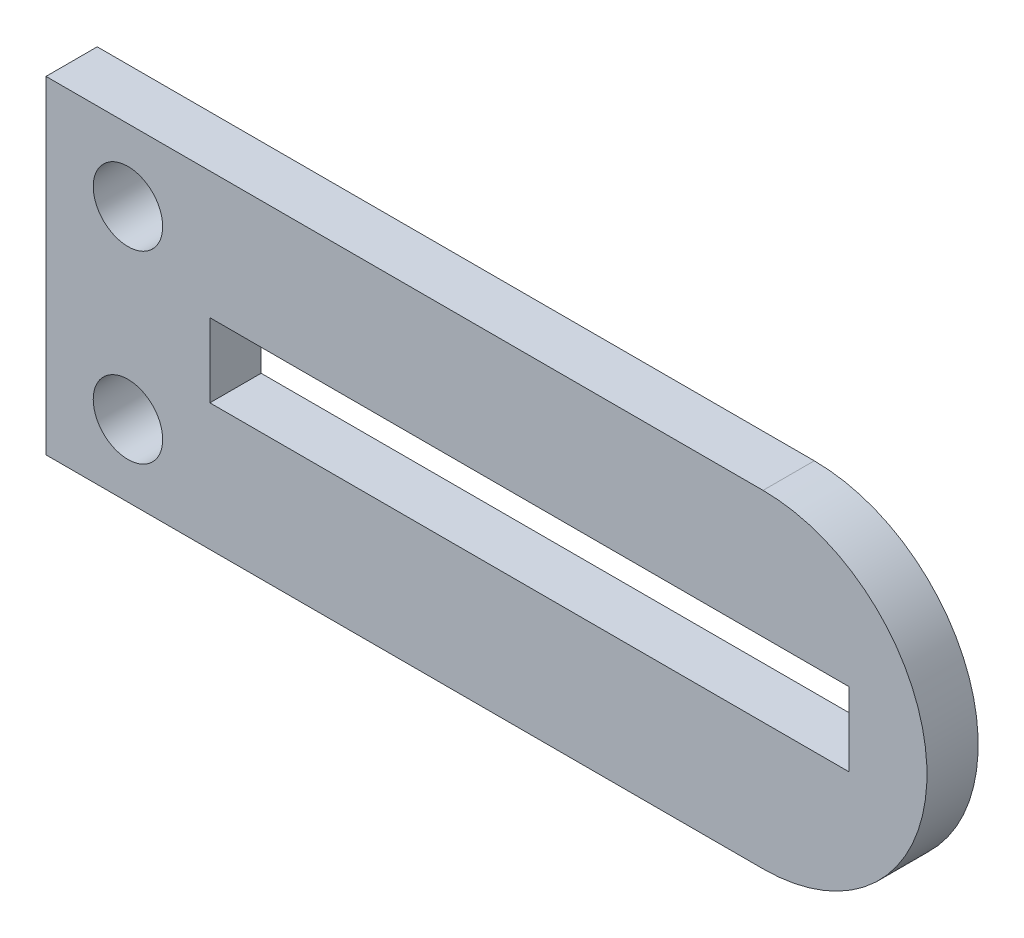
ISO-10303-21;
HEADER;
FILE_DESCRIPTION(('STEP AP214'),'2;1');
FILE_NAME('part.step','',(''),(''),'','','');
FILE_SCHEMA(('AUTOMOTIVE_DESIGN { 1 0 10303 214 1 1 1 1 }'));
ENDSEC;
DATA;
#1=APPLICATION_CONTEXT('core data for automotive mechanical design processes');
#2=APPLICATION_PROTOCOL_DEFINITION('international standard','automotive_design',2000,#1);
#3=PRODUCT_CONTEXT('',#1,'mechanical');
#4=PRODUCT('Part','Part','',(#3));
#5=PRODUCT_RELATED_PRODUCT_CATEGORY('part','',(#4));
#6=PRODUCT_DEFINITION_FORMATION('','',#4);
#7=PRODUCT_DEFINITION_CONTEXT('part definition',#1,'design');
#8=PRODUCT_DEFINITION('design','',#6,#7);
#9=PRODUCT_DEFINITION_SHAPE('','',#8);
#10=(LENGTH_UNIT() NAMED_UNIT(*) SI_UNIT(.MILLI.,.METRE.));
#11=(NAMED_UNIT(*) PLANE_ANGLE_UNIT() SI_UNIT($,.RADIAN.));
#12=(NAMED_UNIT(*) SI_UNIT($,.STERADIAN.) SOLID_ANGLE_UNIT());
#13=UNCERTAINTY_MEASURE_WITH_UNIT(LENGTH_MEASURE(1.E-05),#10,'distance_accuracy_value','');
#14=(GEOMETRIC_REPRESENTATION_CONTEXT(3) GLOBAL_UNCERTAINTY_ASSIGNED_CONTEXT((#13)) GLOBAL_UNIT_ASSIGNED_CONTEXT((#10,
#11,#12)) REPRESENTATION_CONTEXT('',''));
#15=CARTESIAN_POINT('',(0.,0.,0.));
#16=DIRECTION('',(0.,0.,1.));
#17=DIRECTION('',(1.,0.,0.));
#18=AXIS2_PLACEMENT_3D('',#15,#16,#17);
#19=CARTESIAN_POINT('',(44.45,10.16,3.175));
#20=DIRECTION('',(0.,0.,-1.));
#21=DIRECTION('',(-1.,0.,0.));
#22=AXIS2_PLACEMENT_3D('',#19,#20,#21);
#23=PLANE('',#22);
#24=DIRECTION('',(1.,0.,0.));
#25=VECTOR('',#24,1.);
#26=CARTESIAN_POINT('',(44.45,0.,3.175));
#27=LINE('',#26,#25);
#28=CARTESIAN_POINT('',(0.,0.,3.175));
#29=VERTEX_POINT('',#28);
#30=CARTESIAN_POINT('',(44.45,0.,3.175));
#31=VERTEX_POINT('',#30);
#32=EDGE_CURVE('E145',#29,#31,#27,.T.);
#33=ORIENTED_EDGE('',*,*,#32,.T.);
#34=CARTESIAN_POINT('',(44.45,10.16,3.175));
#35=DIRECTION('',(0.,0.,1.));
#36=DIRECTION('',(-1.,0.,0.));
#37=AXIS2_PLACEMENT_3D('',#34,#35,#36);
#38=CIRCLE('',#37,10.16);
#39=CARTESIAN_POINT('',(44.45,20.32,3.175));
#40=VERTEX_POINT('',#39);
#41=EDGE_CURVE('E148',#31,#40,#38,.T.);
#42=ORIENTED_EDGE('',*,*,#41,.T.);
#43=DIRECTION('',(-1.,0.,0.));
#44=VECTOR('',#43,1.);
#45=CARTESIAN_POINT('',(0.,20.32,3.175));
#46=LINE('',#45,#44);
#47=CARTESIAN_POINT('',(0.,20.32,3.175));
#48=VERTEX_POINT('',#47);
#49=EDGE_CURVE('E151',#40,#48,#46,.T.);
#50=ORIENTED_EDGE('',*,*,#49,.T.);
#51=DIRECTION('',(0.,-1.,0.));
#52=VECTOR('',#51,1.);
#53=CARTESIAN_POINT('',(0.,0.,3.175));
#54=LINE('',#53,#52);
#55=EDGE_CURVE('E153',#48,#29,#54,.T.);
#56=ORIENTED_EDGE('',*,*,#55,.T.);
#57=EDGE_LOOP('',(#33,#42,#50,#56));
#58=FACE_BOUND('',#57,.T.);
#59=DIRECTION('',(0.,1.,0.));
#60=VECTOR('',#59,1.);
#61=CARTESIAN_POINT('',(49.784,7.874,3.175));
#62=LINE('',#61,#60);
#63=CARTESIAN_POINT('',(49.784,7.874,3.175));
#64=VERTEX_POINT('',#63);
#65=CARTESIAN_POINT('',(49.784,12.446,3.175));
#66=VERTEX_POINT('',#65);
#67=EDGE_CURVE('E106',#64,#66,#62,.T.);
#68=ORIENTED_EDGE('',*,*,#67,.F.);
#69=DIRECTION('',(1.,0.,0.));
#70=VECTOR('',#69,1.);
#71=CARTESIAN_POINT('',(10.16,7.874,3.175));
#72=LINE('',#71,#70);
#73=CARTESIAN_POINT('',(10.16,7.874,3.175));
#74=VERTEX_POINT('',#73);
#75=EDGE_CURVE('E129',#74,#64,#72,.T.);
#76=ORIENTED_EDGE('',*,*,#75,.F.);
#77=DIRECTION('',(0.,-1.,0.));
#78=VECTOR('',#77,1.);
#79=CARTESIAN_POINT('',(10.16,7.874,3.175));
#80=LINE('',#79,#78);
#81=CARTESIAN_POINT('',(10.16,12.446,3.175));
#82=VERTEX_POINT('',#81);
#83=EDGE_CURVE('E127',#82,#74,#80,.T.);
#84=ORIENTED_EDGE('',*,*,#83,.F.);
#85=DIRECTION('',(-1.,0.,0.));
#86=VECTOR('',#85,1.);
#87=CARTESIAN_POINT('',(10.16,12.446,3.175));
#88=LINE('',#87,#86);
#89=EDGE_CURVE('E114',#66,#82,#88,.T.);
#90=ORIENTED_EDGE('',*,*,#89,.F.);
#91=EDGE_LOOP('',(#68,#76,#84,#90));
#92=FACE_BOUND('',#91,.T.);
#93=CARTESIAN_POINT('',(5.08,15.875,3.175));
#94=DIRECTION('',(0.,0.,1.));
#95=DIRECTION('',(1.,0.,0.));
#96=AXIS2_PLACEMENT_3D('',#93,#94,#95);
#97=CIRCLE('',#96,2.15265);
#98=CARTESIAN_POINT('',(7.23265,15.875,3.175));
#99=VERTEX_POINT('',#98);
#100=EDGE_CURVE('E135',#99,#99,#97,.T.);
#101=ORIENTED_EDGE('',*,*,#100,.F.);
#102=EDGE_LOOP('',(#101));
#103=FACE_BOUND('',#102,.T.);
#104=CARTESIAN_POINT('',(5.08,4.445,3.175));
#105=DIRECTION('',(0.,0.,1.));
#106=DIRECTION('',(-1.,0.,0.));
#107=AXIS2_PLACEMENT_3D('',#104,#105,#106);
#108=CIRCLE('',#107,2.15265);
#109=CARTESIAN_POINT('',(2.92735,4.445,3.175));
#110=VERTEX_POINT('',#109);
#111=EDGE_CURVE('E234',#110,#110,#108,.T.);
#112=ORIENTED_EDGE('',*,*,#111,.F.);
#113=EDGE_LOOP('',(#112));
#114=FACE_BOUND('',#113,.T.);
#115=ADVANCED_FACE('F41',(#58,#92,#103,#114),#23,.F.);
#116=CARTESIAN_POINT('',(44.45,10.16,0.));
#117=DIRECTION('',(0.,0.,-1.));
#118=DIRECTION('',(-1.,0.,0.));
#119=AXIS2_PLACEMENT_3D('',#116,#117,#118);
#120=PLANE('',#119);
#121=CARTESIAN_POINT('',(5.08,15.875,0.));
#122=DIRECTION('',(0.,0.,1.));
#123=DIRECTION('',(1.,0.,0.));
#124=AXIS2_PLACEMENT_3D('',#121,#122,#123);
#125=CIRCLE('',#124,2.15265);
#126=CARTESIAN_POINT('',(7.23265,15.875,0.));
#127=VERTEX_POINT('',#126);
#128=EDGE_CURVE('E240',#127,#127,#125,.T.);
#129=ORIENTED_EDGE('',*,*,#128,.T.);
#130=EDGE_LOOP('',(#129));
#131=FACE_BOUND('',#130,.T.);
#132=DIRECTION('',(1.,0.,0.));
#133=VECTOR('',#132,1.);
#134=CARTESIAN_POINT('',(44.45,0.,0.));
#135=LINE('',#134,#133);
#136=CARTESIAN_POINT('',(0.,0.,0.));
#137=VERTEX_POINT('',#136);
#138=CARTESIAN_POINT('',(44.45,0.,0.));
#139=VERTEX_POINT('',#138);
#140=EDGE_CURVE('E122',#137,#139,#135,.T.);
#141=ORIENTED_EDGE('',*,*,#140,.F.);
#142=DIRECTION('',(0.,-1.,0.));
#143=VECTOR('',#142,1.);
#144=CARTESIAN_POINT('',(0.,0.,0.));
#145=LINE('',#144,#143);
#146=CARTESIAN_POINT('',(0.,20.32,0.));
#147=VERTEX_POINT('',#146);
#148=EDGE_CURVE('E149',#147,#137,#145,.T.);
#149=ORIENTED_EDGE('',*,*,#148,.F.);
#150=DIRECTION('',(-1.,0.,0.));
#151=VECTOR('',#150,1.);
#152=CARTESIAN_POINT('',(0.,20.32,0.));
#153=LINE('',#152,#151);
#154=CARTESIAN_POINT('',(44.45,20.32,0.));
#155=VERTEX_POINT('',#154);
#156=EDGE_CURVE('E160',#155,#147,#153,.T.);
#157=ORIENTED_EDGE('',*,*,#156,.F.);
#158=CARTESIAN_POINT('',(44.45,10.16,0.));
#159=DIRECTION('',(0.,0.,1.));
#160=DIRECTION('',(-1.,0.,0.));
#161=AXIS2_PLACEMENT_3D('',#158,#159,#160);
#162=CIRCLE('',#161,10.16);
#163=EDGE_CURVE('E158',#139,#155,#162,.T.);
#164=ORIENTED_EDGE('',*,*,#163,.F.);
#165=EDGE_LOOP('',(#141,#149,#157,#164));
#166=FACE_BOUND('',#165,.T.);
#167=DIRECTION('',(1.,0.,0.));
#168=VECTOR('',#167,1.);
#169=CARTESIAN_POINT('',(10.16,7.874,0.));
#170=LINE('',#169,#168);
#171=CARTESIAN_POINT('',(10.16,7.874,0.));
#172=VERTEX_POINT('',#171);
#173=CARTESIAN_POINT('',(49.784,7.874,0.));
#174=VERTEX_POINT('',#173);
#175=EDGE_CURVE('E115',#172,#174,#170,.T.);
#176=ORIENTED_EDGE('',*,*,#175,.T.);
#177=DIRECTION('',(0.,1.,0.));
#178=VECTOR('',#177,1.);
#179=CARTESIAN_POINT('',(49.784,7.874,0.));
#180=LINE('',#179,#178);
#181=CARTESIAN_POINT('',(49.784,12.446,0.));
#182=VERTEX_POINT('',#181);
#183=EDGE_CURVE('E64',#174,#182,#180,.T.);
#184=ORIENTED_EDGE('',*,*,#183,.T.);
#185=DIRECTION('',(-1.,0.,0.));
#186=VECTOR('',#185,1.);
#187=CARTESIAN_POINT('',(10.16,12.446,0.));
#188=LINE('',#187,#186);
#189=CARTESIAN_POINT('',(10.16,12.446,0.));
#190=VERTEX_POINT('',#189);
#191=EDGE_CURVE('E121',#182,#190,#188,.T.);
#192=ORIENTED_EDGE('',*,*,#191,.T.);
#193=DIRECTION('',(0.,-1.,0.));
#194=VECTOR('',#193,1.);
#195=CARTESIAN_POINT('',(10.16,7.874,0.));
#196=LINE('',#195,#194);
#197=EDGE_CURVE('E137',#190,#172,#196,.T.);
#198=ORIENTED_EDGE('',*,*,#197,.T.);
#199=EDGE_LOOP('',(#176,#184,#192,#198));
#200=FACE_BOUND('',#199,.T.);
#201=CARTESIAN_POINT('',(5.08,4.445,0.));
#202=DIRECTION('',(0.,0.,1.));
#203=DIRECTION('',(-1.,0.,0.));
#204=AXIS2_PLACEMENT_3D('',#201,#202,#203);
#205=CIRCLE('',#204,2.15265);
#206=CARTESIAN_POINT('',(2.92735,4.445,0.));
#207=VERTEX_POINT('',#206);
#208=EDGE_CURVE('E237',#207,#207,#205,.T.);
#209=ORIENTED_EDGE('',*,*,#208,.T.);
#210=EDGE_LOOP('',(#209));
#211=FACE_BOUND('',#210,.T.);
#212=ADVANCED_FACE('F178',(#131,#166,#200,#211),#120,.T.);
#213=CARTESIAN_POINT('',(44.45,0.,3.175));
#214=DIRECTION('',(0.,1.,0.));
#215=DIRECTION('',(0.,0.,1.));
#216=AXIS2_PLACEMENT_3D('',#213,#214,#215);
#217=PLANE('',#216);
#218=ORIENTED_EDGE('',*,*,#140,.T.);
#219=DIRECTION('',(0.,0.,-1.));
#220=VECTOR('',#219,1.);
#221=CARTESIAN_POINT('',(44.45,0.,3.175));
#222=LINE('',#221,#220);
#223=EDGE_CURVE('E11',#31,#139,#222,.T.);
#224=ORIENTED_EDGE('',*,*,#223,.F.);
#225=ORIENTED_EDGE('',*,*,#32,.F.);
#226=DIRECTION('',(0.,0.,-1.));
#227=VECTOR('',#226,1.);
#228=CARTESIAN_POINT('',(0.,0.,3.175));
#229=LINE('',#228,#227);
#230=EDGE_CURVE('E155',#29,#137,#229,.T.);
#231=ORIENTED_EDGE('',*,*,#230,.T.);
#232=EDGE_LOOP('',(#218,#224,#225,#231));
#233=FACE_BOUND('',#232,.T.);
#234=ADVANCED_FACE('F43',(#233),#217,.F.);
#235=CARTESIAN_POINT('',(44.45,10.16,3.175));
#236=DIRECTION('',(0.,0.,-1.));
#237=DIRECTION('',(-1.,0.,0.));
#238=AXIS2_PLACEMENT_3D('',#235,#236,#237);
#239=CYLINDRICAL_SURFACE('',#238,10.16);
#240=ORIENTED_EDGE('',*,*,#163,.T.);
#241=DIRECTION('',(0.,0.,-1.));
#242=VECTOR('',#241,1.);
#243=CARTESIAN_POINT('',(44.45,20.32,3.175));
#244=LINE('',#243,#242);
#245=EDGE_CURVE('E49',#40,#155,#244,.T.);
#246=ORIENTED_EDGE('',*,*,#245,.F.);
#247=ORIENTED_EDGE('',*,*,#41,.F.);
#248=ORIENTED_EDGE('',*,*,#223,.T.);
#249=EDGE_LOOP('',(#240,#246,#247,#248));
#250=FACE_BOUND('',#249,.T.);
#251=ADVANCED_FACE('F188',(#250),#239,.T.);
#252=CARTESIAN_POINT('',(0.,20.32,3.175));
#253=DIRECTION('',(0.,-1.,0.));
#254=DIRECTION('',(0.,0.,-1.));
#255=AXIS2_PLACEMENT_3D('',#252,#253,#254);
#256=PLANE('',#255);
#257=ORIENTED_EDGE('',*,*,#156,.T.);
#258=DIRECTION('',(0.,0.,-1.));
#259=VECTOR('',#258,1.);
#260=CARTESIAN_POINT('',(0.,20.32,3.175));
#261=LINE('',#260,#259);
#262=EDGE_CURVE('E165',#48,#147,#261,.T.);
#263=ORIENTED_EDGE('',*,*,#262,.F.);
#264=ORIENTED_EDGE('',*,*,#49,.F.);
#265=ORIENTED_EDGE('',*,*,#245,.T.);
#266=EDGE_LOOP('',(#257,#263,#264,#265));
#267=FACE_BOUND('',#266,.T.);
#268=ADVANCED_FACE('F172',(#267),#256,.F.);
#269=CARTESIAN_POINT('',(0.,0.,3.175));
#270=DIRECTION('',(1.,0.,0.));
#271=DIRECTION('',(0.,0.,-1.));
#272=AXIS2_PLACEMENT_3D('',#269,#270,#271);
#273=PLANE('',#272);
#274=ORIENTED_EDGE('',*,*,#148,.T.);
#275=ORIENTED_EDGE('',*,*,#230,.F.);
#276=ORIENTED_EDGE('',*,*,#55,.F.);
#277=ORIENTED_EDGE('',*,*,#262,.T.);
#278=EDGE_LOOP('',(#274,#275,#276,#277));
#279=FACE_BOUND('',#278,.T.);
#280=ADVANCED_FACE('F182',(#279),#273,.F.);
#281=CARTESIAN_POINT('',(49.784,7.874,3.175));
#282=DIRECTION('',(-1.,0.,0.));
#283=DIRECTION('',(0.,0.,1.));
#284=AXIS2_PLACEMENT_3D('',#281,#282,#283);
#285=PLANE('',#284);
#286=ORIENTED_EDGE('',*,*,#183,.F.);
#287=DIRECTION('',(0.,0.,-1.));
#288=VECTOR('',#287,1.);
#289=CARTESIAN_POINT('',(49.784,7.874,3.175));
#290=LINE('',#289,#288);
#291=EDGE_CURVE('E110',#64,#174,#290,.T.);
#292=ORIENTED_EDGE('',*,*,#291,.F.);
#293=ORIENTED_EDGE('',*,*,#67,.T.);
#294=DIRECTION('',(0.,0.,-1.));
#295=VECTOR('',#294,1.);
#296=CARTESIAN_POINT('',(49.784,12.446,3.175));
#297=LINE('',#296,#295);
#298=EDGE_CURVE('E109',#66,#182,#297,.T.);
#299=ORIENTED_EDGE('',*,*,#298,.T.);
#300=EDGE_LOOP('',(#286,#292,#293,#299));
#301=FACE_BOUND('',#300,.T.);
#302=ADVANCED_FACE('F108',(#301),#285,.T.);
#303=CARTESIAN_POINT('',(10.16,12.446,3.175));
#304=DIRECTION('',(0.,-1.,0.));
#305=DIRECTION('',(0.,0.,-1.));
#306=AXIS2_PLACEMENT_3D('',#303,#304,#305);
#307=PLANE('',#306);
#308=ORIENTED_EDGE('',*,*,#191,.F.);
#309=ORIENTED_EDGE('',*,*,#298,.F.);
#310=ORIENTED_EDGE('',*,*,#89,.T.);
#311=DIRECTION('',(0.,0.,-1.));
#312=VECTOR('',#311,1.);
#313=CARTESIAN_POINT('',(10.16,12.446,3.175));
#314=LINE('',#313,#312);
#315=EDGE_CURVE('E123',#82,#190,#314,.T.);
#316=ORIENTED_EDGE('',*,*,#315,.T.);
#317=EDGE_LOOP('',(#308,#309,#310,#316));
#318=FACE_BOUND('',#317,.T.);
#319=ADVANCED_FACE('F118',(#318),#307,.T.);
#320=CARTESIAN_POINT('',(10.16,7.874,3.175));
#321=DIRECTION('',(1.,0.,0.));
#322=DIRECTION('',(0.,0.,-1.));
#323=AXIS2_PLACEMENT_3D('',#320,#321,#322);
#324=PLANE('',#323);
#325=ORIENTED_EDGE('',*,*,#197,.F.);
#326=ORIENTED_EDGE('',*,*,#315,.F.);
#327=ORIENTED_EDGE('',*,*,#83,.T.);
#328=DIRECTION('',(0.,0.,-1.));
#329=VECTOR('',#328,1.);
#330=CARTESIAN_POINT('',(10.16,7.874,3.175));
#331=LINE('',#330,#329);
#332=EDGE_CURVE('E56',#74,#172,#331,.T.);
#333=ORIENTED_EDGE('',*,*,#332,.T.);
#334=EDGE_LOOP('',(#325,#326,#327,#333));
#335=FACE_BOUND('',#334,.T.);
#336=ADVANCED_FACE('F212',(#335),#324,.T.);
#337=CARTESIAN_POINT('',(10.16,7.874,3.175));
#338=DIRECTION('',(0.,1.,0.));
#339=DIRECTION('',(0.,0.,1.));
#340=AXIS2_PLACEMENT_3D('',#337,#338,#339);
#341=PLANE('',#340);
#342=ORIENTED_EDGE('',*,*,#175,.F.);
#343=ORIENTED_EDGE('',*,*,#332,.F.);
#344=ORIENTED_EDGE('',*,*,#75,.T.);
#345=ORIENTED_EDGE('',*,*,#291,.T.);
#346=EDGE_LOOP('',(#342,#343,#344,#345));
#347=FACE_BOUND('',#346,.T.);
#348=ADVANCED_FACE('F216',(#347),#341,.T.);
#349=CARTESIAN_POINT('',(5.08,15.875,3.175));
#350=DIRECTION('',(0.,0.,-1.));
#351=DIRECTION('',(-1.,0.,0.));
#352=AXIS2_PLACEMENT_3D('',#349,#350,#351);
#353=CYLINDRICAL_SURFACE('',#352,2.15265);
#354=ORIENTED_EDGE('',*,*,#100,.T.);
#355=EDGE_LOOP('',(#354));
#356=FACE_BOUND('',#355,.T.);
#357=ORIENTED_EDGE('',*,*,#128,.F.);
#358=EDGE_LOOP('',(#357));
#359=FACE_BOUND('',#358,.T.);
#360=ADVANCED_FACE('F222',(#356,#359),#353,.F.);
#361=CARTESIAN_POINT('',(5.08,4.445,3.175));
#362=DIRECTION('',(0.,0.,-1.));
#363=DIRECTION('',(-1.,0.,0.));
#364=AXIS2_PLACEMENT_3D('',#361,#362,#363);
#365=CYLINDRICAL_SURFACE('',#364,2.15265);
#366=ORIENTED_EDGE('',*,*,#111,.T.);
#367=EDGE_LOOP('',(#366));
#368=FACE_BOUND('',#367,.T.);
#369=ORIENTED_EDGE('',*,*,#208,.F.);
#370=EDGE_LOOP('',(#369));
#371=FACE_BOUND('',#370,.T.);
#372=ADVANCED_FACE('F225',(#368,#371),#365,.F.);
#373=CLOSED_SHELL('',(#115,#212,#234,#251,#268,#280,#302,#319,#336,#348,#360,#372));
#374=MANIFOLD_SOLID_BREP('B2',#373);
#375=ADVANCED_BREP_SHAPE_REPRESENTATION('',(#18,#374),#14);
#376=SHAPE_DEFINITION_REPRESENTATION(#9,#375);
ENDSEC;
END-ISO-10303-21;
